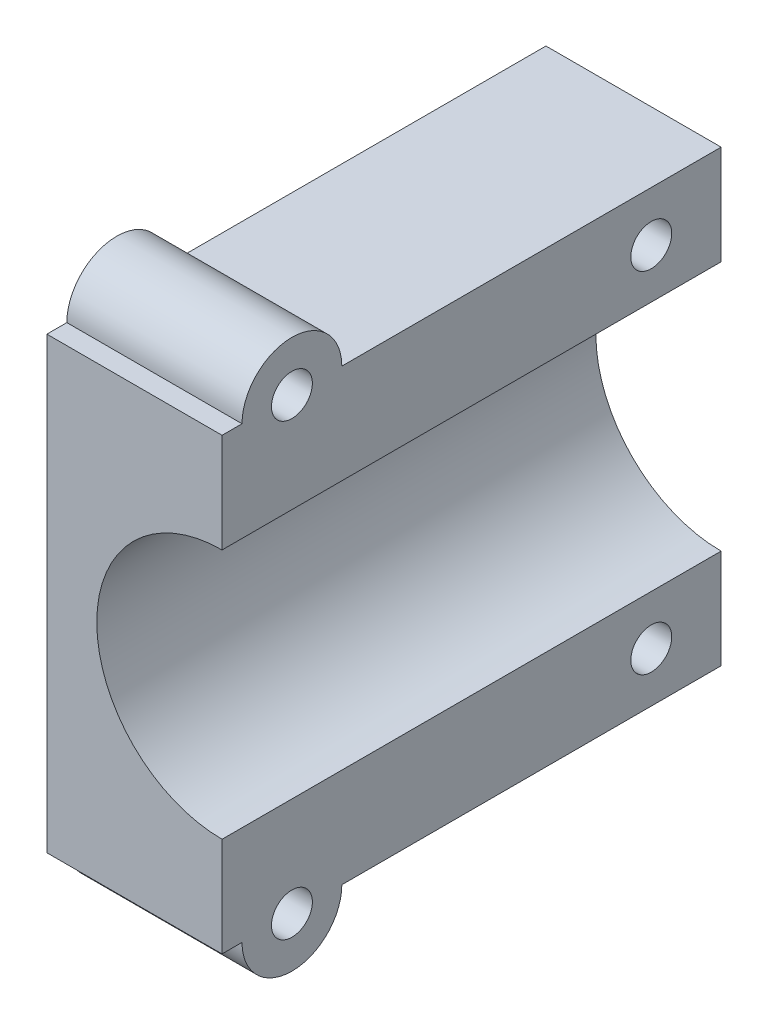
ISO-10303-21;
HEADER;
FILE_DESCRIPTION(('STEP AP214'),'2;1');
FILE_NAME('part.step','',(''),(''),'','','');
FILE_SCHEMA(('AUTOMOTIVE_DESIGN { 1 0 10303 214 1 1 1 1 }'));
ENDSEC;
DATA;
#1=APPLICATION_CONTEXT('core data for automotive mechanical design processes');
#2=APPLICATION_PROTOCOL_DEFINITION('international standard','automotive_design',2000,#1);
#3=PRODUCT_CONTEXT('',#1,'mechanical');
#4=PRODUCT('Part','Part','',(#3));
#5=PRODUCT_RELATED_PRODUCT_CATEGORY('part','',(#4));
#6=PRODUCT_DEFINITION_FORMATION('','',#4);
#7=PRODUCT_DEFINITION_CONTEXT('part definition',#1,'design');
#8=PRODUCT_DEFINITION('design','',#6,#7);
#9=PRODUCT_DEFINITION_SHAPE('','',#8);
#10=(LENGTH_UNIT() NAMED_UNIT(*) SI_UNIT(.MILLI.,.METRE.));
#11=(NAMED_UNIT(*) PLANE_ANGLE_UNIT() SI_UNIT($,.RADIAN.));
#12=(NAMED_UNIT(*) SI_UNIT($,.STERADIAN.) SOLID_ANGLE_UNIT());
#13=UNCERTAINTY_MEASURE_WITH_UNIT(LENGTH_MEASURE(1.E-05),#10,'distance_accuracy_value','');
#14=(GEOMETRIC_REPRESENTATION_CONTEXT(3) GLOBAL_UNCERTAINTY_ASSIGNED_CONTEXT((#13)) GLOBAL_UNIT_ASSIGNED_CONTEXT((#10,
#11,#12)) REPRESENTATION_CONTEXT('',''));
#15=CARTESIAN_POINT('',(0.,0.,0.));
#16=DIRECTION('',(0.,0.,1.));
#17=DIRECTION('',(1.,0.,0.));
#18=AXIS2_PLACEMENT_3D('',#15,#16,#17);
#19=CARTESIAN_POINT('',(-17.55,45.,25.));
#20=DIRECTION('',(0.,1.,0.));
#21=DIRECTION('',(0.,0.,1.));
#22=AXIS2_PLACEMENT_3D('',#19,#20,#21);
#23=PLANE('',#22);
#24=DIRECTION('',(0.,0.,-1.));
#25=VECTOR('',#24,1.);
#26=CARTESIAN_POINT('',(-17.55,45.,25.));
#27=LINE('',#26,#25);
#28=CARTESIAN_POINT('',(-17.55,45.,13.));
#29=VERTEX_POINT('',#28);
#30=CARTESIAN_POINT('',(-17.55,45.,-25.));
#31=VERTEX_POINT('',#30);
#32=EDGE_CURVE('E126',#29,#31,#27,.T.);
#33=ORIENTED_EDGE('',*,*,#32,.F.);
#34=DIRECTION('',(-1.,0.,0.));
#35=VECTOR('',#34,1.);
#36=CARTESIAN_POINT('',(0.,45.,13.));
#37=LINE('',#36,#35);
#38=CARTESIAN_POINT('',(0.,45.,13.));
#39=VERTEX_POINT('',#38);
#40=EDGE_CURVE('E113',#39,#29,#37,.T.);
#41=ORIENTED_EDGE('',*,*,#40,.F.);
#42=DIRECTION('',(0.,0.,1.));
#43=VECTOR('',#42,1.);
#44=CARTESIAN_POINT('',(0.,45.,-25.));
#45=LINE('',#44,#43);
#46=CARTESIAN_POINT('',(0.,45.,-25.));
#47=VERTEX_POINT('',#46);
#48=EDGE_CURVE('E124',#47,#39,#45,.T.);
#49=ORIENTED_EDGE('',*,*,#48,.F.);
#50=DIRECTION('',(1.,0.,0.));
#51=VECTOR('',#50,1.);
#52=CARTESIAN_POINT('',(-17.55,45.,-25.));
#53=LINE('',#52,#51);
#54=EDGE_CURVE('E155',#31,#47,#53,.T.);
#55=ORIENTED_EDGE('',*,*,#54,.F.);
#56=EDGE_LOOP('',(#33,#41,#49,#55));
#57=FACE_BOUND('',#56,.T.);
#58=ADVANCED_FACE('F35',(#57),#23,.T.);
#59=CARTESIAN_POINT('',(0.,45.,23.));
#60=VERTEX_POINT('',#59);
#61=CARTESIAN_POINT('',(0.,45.,25.));
#62=VERTEX_POINT('',#61);
#63=EDGE_CURVE('E132',#60,#62,#45,.T.);
#64=ORIENTED_EDGE('',*,*,#63,.F.);
#65=DIRECTION('',(-1.,0.,0.));
#66=VECTOR('',#65,1.);
#67=CARTESIAN_POINT('',(0.,45.,23.));
#68=LINE('',#67,#66);
#69=CARTESIAN_POINT('',(-17.55,45.,23.));
#70=VERTEX_POINT('',#69);
#71=EDGE_CURVE('E51',#60,#70,#68,.T.);
#72=ORIENTED_EDGE('',*,*,#71,.T.);
#73=CARTESIAN_POINT('',(-17.55,45.,25.));
#74=VERTEX_POINT('',#73);
#75=EDGE_CURVE('E160',#74,#70,#27,.T.);
#76=ORIENTED_EDGE('',*,*,#75,.F.);
#77=DIRECTION('',(1.,0.,0.));
#78=VECTOR('',#77,1.);
#79=CARTESIAN_POINT('',(-17.55,45.,25.));
#80=LINE('',#79,#78);
#81=EDGE_CURVE('E156',#74,#62,#80,.T.);
#82=ORIENTED_EDGE('',*,*,#81,.T.);
#83=EDGE_LOOP('',(#64,#72,#76,#82));
#84=FACE_BOUND('',#83,.T.);
#85=ADVANCED_FACE('F231',(#84),#23,.T.);
#86=CARTESIAN_POINT('',(-17.55,0.,25.));
#87=DIRECTION('',(0.,1.,0.));
#88=DIRECTION('',(0.,0.,1.));
#89=AXIS2_PLACEMENT_3D('',#86,#87,#88);
#90=PLANE('',#89);
#91=DIRECTION('',(0.,0.,-1.));
#92=VECTOR('',#91,1.);
#93=CARTESIAN_POINT('',(0.,0.,-25.));
#94=LINE('',#93,#92);
#95=CARTESIAN_POINT('',(0.,0.,13.));
#96=VERTEX_POINT('',#95);
#97=CARTESIAN_POINT('',(0.,0.,-25.));
#98=VERTEX_POINT('',#97);
#99=EDGE_CURVE('E131',#96,#98,#94,.T.);
#100=ORIENTED_EDGE('',*,*,#99,.F.);
#101=DIRECTION('',(-1.,0.,0.));
#102=VECTOR('',#101,1.);
#103=CARTESIAN_POINT('',(0.,0.,13.));
#104=LINE('',#103,#102);
#105=CARTESIAN_POINT('',(-17.55,0.,13.));
#106=VERTEX_POINT('',#105);
#107=EDGE_CURVE('E191',#96,#106,#104,.T.);
#108=ORIENTED_EDGE('',*,*,#107,.T.);
#109=DIRECTION('',(0.,0.,-1.));
#110=VECTOR('',#109,1.);
#111=CARTESIAN_POINT('',(-17.55,0.,25.));
#112=LINE('',#111,#110);
#113=CARTESIAN_POINT('',(-17.55,0.,-25.));
#114=VERTEX_POINT('',#113);
#115=EDGE_CURVE('E44',#106,#114,#112,.T.);
#116=ORIENTED_EDGE('',*,*,#115,.T.);
#117=DIRECTION('',(1.,0.,0.));
#118=VECTOR('',#117,1.);
#119=CARTESIAN_POINT('',(-17.55,0.,-25.));
#120=LINE('',#119,#118);
#121=EDGE_CURVE('E178',#114,#98,#120,.T.);
#122=ORIENTED_EDGE('',*,*,#121,.T.);
#123=EDGE_LOOP('',(#100,#108,#116,#122));
#124=FACE_BOUND('',#123,.T.);
#125=ADVANCED_FACE('F236',(#124),#90,.F.);
#126=CARTESIAN_POINT('',(-17.55,22.5,25.));
#127=DIRECTION('',(1.,0.,0.));
#128=DIRECTION('',(0.,1.,0.));
#129=AXIS2_PLACEMENT_3D('',#126,#127,#128);
#130=PLANE('',#129);
#131=CARTESIAN_POINT('',(-17.55,45.,18.));
#132=DIRECTION('',(1.,0.,0.));
#133=DIRECTION('',(0.,1.,0.));
#134=AXIS2_PLACEMENT_3D('',#131,#132,#133);
#135=CIRCLE('',#134,2.05);
#136=CARTESIAN_POINT('',(-17.55,47.05,18.));
#137=VERTEX_POINT('',#136);
#138=EDGE_CURVE('E214',#137,#137,#135,.T.);
#139=ORIENTED_EDGE('',*,*,#138,.T.);
#140=EDGE_LOOP('',(#139));
#141=FACE_BOUND('',#140,.T.);
#142=CARTESIAN_POINT('',(-17.55,0.,18.));
#143=DIRECTION('',(-1.,0.,0.));
#144=DIRECTION('',(0.,-1.,0.));
#145=AXIS2_PLACEMENT_3D('',#142,#143,#144);
#146=CIRCLE('',#145,2.05);
#147=CARTESIAN_POINT('',(-17.55,-2.05,18.));
#148=VERTEX_POINT('',#147);
#149=EDGE_CURVE('E206',#148,#148,#146,.T.);
#150=ORIENTED_EDGE('',*,*,#149,.F.);
#151=EDGE_LOOP('',(#150));
#152=FACE_BOUND('',#151,.T.);
#153=CARTESIAN_POINT('',(-17.55,40.,-18.));
#154=DIRECTION('',(1.,0.,0.));
#155=DIRECTION('',(0.,0.,1.));
#156=AXIS2_PLACEMENT_3D('',#153,#154,#155);
#157=CIRCLE('',#156,2.05);
#158=CARTESIAN_POINT('',(-17.55,40.,-15.95));
#159=VERTEX_POINT('',#158);
#160=EDGE_CURVE('E152',#159,#159,#157,.T.);
#161=ORIENTED_EDGE('',*,*,#160,.T.);
#162=EDGE_LOOP('',(#161));
#163=FACE_BOUND('',#162,.T.);
#164=CARTESIAN_POINT('',(-17.55,5.,-18.));
#165=DIRECTION('',(-1.,0.,0.));
#166=DIRECTION('',(0.,0.,1.));
#167=AXIS2_PLACEMENT_3D('',#164,#165,#166);
#168=CIRCLE('',#167,2.05);
#169=CARTESIAN_POINT('',(-17.55,5.,-15.95));
#170=VERTEX_POINT('',#169);
#171=EDGE_CURVE('E163',#170,#170,#168,.T.);
#172=ORIENTED_EDGE('',*,*,#171,.F.);
#173=EDGE_LOOP('',(#172));
#174=FACE_BOUND('',#173,.T.);
#175=DIRECTION('',(0.,-1.,0.));
#176=VECTOR('',#175,1.);
#177=CARTESIAN_POINT('',(-17.55,22.5,-25.));
#178=LINE('',#177,#176);
#179=EDGE_CURVE('E166',#31,#114,#178,.T.);
#180=ORIENTED_EDGE('',*,*,#179,.T.);
#181=ORIENTED_EDGE('',*,*,#115,.F.);
#182=CARTESIAN_POINT('',(-17.55,0.,18.));
#183=DIRECTION('',(-1.,0.,0.));
#184=DIRECTION('',(0.,-1.,0.));
#185=AXIS2_PLACEMENT_3D('',#182,#183,#184);
#186=CIRCLE('',#185,5.);
#187=CARTESIAN_POINT('',(-17.55,0.,23.));
#188=VERTEX_POINT('',#187);
#189=EDGE_CURVE('E199',#106,#188,#186,.T.);
#190=ORIENTED_EDGE('',*,*,#189,.T.);
#191=CARTESIAN_POINT('',(-17.55,0.,25.));
#192=VERTEX_POINT('',#191);
#193=EDGE_CURVE('E11',#192,#188,#112,.T.);
#194=ORIENTED_EDGE('',*,*,#193,.F.);
#195=DIRECTION('',(0.,-1.,0.));
#196=VECTOR('',#195,1.);
#197=CARTESIAN_POINT('',(-17.55,22.5,25.));
#198=LINE('',#197,#196);
#199=EDGE_CURVE('E167',#74,#192,#198,.T.);
#200=ORIENTED_EDGE('',*,*,#199,.F.);
#201=ORIENTED_EDGE('',*,*,#75,.T.);
#202=CARTESIAN_POINT('',(-17.55,45.,18.));
#203=DIRECTION('',(1.,0.,0.));
#204=DIRECTION('',(0.,1.,0.));
#205=AXIS2_PLACEMENT_3D('',#202,#203,#204);
#206=CIRCLE('',#205,5.);
#207=EDGE_CURVE('E118',#29,#70,#206,.T.);
#208=ORIENTED_EDGE('',*,*,#207,.F.);
#209=ORIENTED_EDGE('',*,*,#32,.T.);
#210=EDGE_LOOP('',(#180,#181,#190,#194,#200,#201,#208,#209));
#211=FACE_BOUND('',#210,.T.);
#212=ADVANCED_FACE('F37',(#141,#152,#163,#174,#211),#130,.F.);
#213=ORIENTED_EDGE('',*,*,#193,.T.);
#214=DIRECTION('',(-1.,0.,0.));
#215=VECTOR('',#214,1.);
#216=CARTESIAN_POINT('',(0.,0.,23.));
#217=LINE('',#216,#215);
#218=CARTESIAN_POINT('',(0.,0.,23.));
#219=VERTEX_POINT('',#218);
#220=EDGE_CURVE('E193',#219,#188,#217,.T.);
#221=ORIENTED_EDGE('',*,*,#220,.F.);
#222=CARTESIAN_POINT('',(0.,0.,25.));
#223=VERTEX_POINT('',#222);
#224=EDGE_CURVE('E134',#223,#219,#94,.T.);
#225=ORIENTED_EDGE('',*,*,#224,.F.);
#226=DIRECTION('',(1.,0.,0.));
#227=VECTOR('',#226,1.);
#228=CARTESIAN_POINT('',(-17.55,0.,25.));
#229=LINE('',#228,#227);
#230=EDGE_CURVE('E169',#192,#223,#229,.T.);
#231=ORIENTED_EDGE('',*,*,#230,.F.);
#232=EDGE_LOOP('',(#213,#221,#225,#231));
#233=FACE_BOUND('',#232,.T.);
#234=ADVANCED_FACE('F253',(#233),#90,.F.);
#235=CARTESIAN_POINT('',(0.,22.5,25.));
#236=DIRECTION('',(0.,0.,-1.));
#237=DIRECTION('',(-1.,0.,0.));
#238=AXIS2_PLACEMENT_3D('',#235,#236,#237);
#239=CYLINDRICAL_SURFACE('',#238,12.55);
#240=CARTESIAN_POINT('',(0.,22.5,-25.));
#241=DIRECTION('',(0.,0.,-1.));
#242=DIRECTION('',(1.,0.,0.));
#243=AXIS2_PLACEMENT_3D('',#240,#241,#242);
#244=CIRCLE('',#243,12.55);
#245=CARTESIAN_POINT('',(0.,9.95000000000002,-25.));
#246=VERTEX_POINT('',#245);
#247=CARTESIAN_POINT('',(0.,35.05,-25.));
#248=VERTEX_POINT('',#247);
#249=EDGE_CURVE('E170',#246,#248,#244,.T.);
#250=ORIENTED_EDGE('',*,*,#249,.T.);
#251=DIRECTION('',(0.,0.,-1.));
#252=VECTOR('',#251,1.);
#253=CARTESIAN_POINT('',(0.,35.05,25.));
#254=LINE('',#253,#252);
#255=CARTESIAN_POINT('',(0.,35.05,25.));
#256=VERTEX_POINT('',#255);
#257=EDGE_CURVE('E149',#248,#256,#254,.F.);
#258=ORIENTED_EDGE('',*,*,#257,.T.);
#259=CARTESIAN_POINT('',(0.,22.5,25.));
#260=DIRECTION('',(0.,0.,-1.));
#261=DIRECTION('',(1.,0.,0.));
#262=AXIS2_PLACEMENT_3D('',#259,#260,#261);
#263=CIRCLE('',#262,12.55);
#264=CARTESIAN_POINT('',(0.,9.95000000000001,25.));
#265=VERTEX_POINT('',#264);
#266=EDGE_CURVE('E173',#265,#256,#263,.T.);
#267=ORIENTED_EDGE('',*,*,#266,.F.);
#268=DIRECTION('',(0.,0.,-1.));
#269=VECTOR('',#268,1.);
#270=CARTESIAN_POINT('',(0.,9.95000000000001,25.));
#271=LINE('',#270,#269);
#272=EDGE_CURVE('E145',#265,#246,#271,.T.);
#273=ORIENTED_EDGE('',*,*,#272,.T.);
#274=EDGE_LOOP('',(#250,#258,#267,#273));
#275=FACE_BOUND('',#274,.T.);
#276=ADVANCED_FACE('F184',(#275),#239,.F.);
#277=CARTESIAN_POINT('',(0.,22.5,25.));
#278=DIRECTION('',(0.,0.,1.));
#279=DIRECTION('',(1.,0.,0.));
#280=AXIS2_PLACEMENT_3D('',#277,#278,#279);
#281=PLANE('',#280);
#282=DIRECTION('',(0.,-1.,0.));
#283=VECTOR('',#282,1.);
#284=CARTESIAN_POINT('',(0.,22.5,25.));
#285=LINE('',#284,#283);
#286=EDGE_CURVE('E146',#62,#256,#285,.T.);
#287=ORIENTED_EDGE('',*,*,#286,.F.);
#288=ORIENTED_EDGE('',*,*,#81,.F.);
#289=ORIENTED_EDGE('',*,*,#199,.T.);
#290=ORIENTED_EDGE('',*,*,#230,.T.);
#291=EDGE_CURVE('E143',#265,#223,#285,.T.);
#292=ORIENTED_EDGE('',*,*,#291,.F.);
#293=ORIENTED_EDGE('',*,*,#266,.T.);
#294=EDGE_LOOP('',(#287,#288,#289,#290,#292,#293));
#295=FACE_BOUND('',#294,.T.);
#296=ADVANCED_FACE('F246',(#295),#281,.T.);
#297=CARTESIAN_POINT('',(0.,22.5,-25.));
#298=DIRECTION('',(0.,0.,1.));
#299=DIRECTION('',(1.,0.,0.));
#300=AXIS2_PLACEMENT_3D('',#297,#298,#299);
#301=PLANE('',#300);
#302=ORIENTED_EDGE('',*,*,#54,.T.);
#303=DIRECTION('',(0.,1.,0.));
#304=VECTOR('',#303,1.);
#305=CARTESIAN_POINT('',(0.,45.,-25.));
#306=LINE('',#305,#304);
#307=EDGE_CURVE('E130',#248,#47,#306,.T.);
#308=ORIENTED_EDGE('',*,*,#307,.F.);
#309=ORIENTED_EDGE('',*,*,#249,.F.);
#310=EDGE_CURVE('E136',#98,#246,#306,.T.);
#311=ORIENTED_EDGE('',*,*,#310,.F.);
#312=ORIENTED_EDGE('',*,*,#121,.F.);
#313=ORIENTED_EDGE('',*,*,#179,.F.);
#314=EDGE_LOOP('',(#302,#308,#309,#311,#312,#313));
#315=FACE_BOUND('',#314,.T.);
#316=ADVANCED_FACE('F188',(#315),#301,.F.);
#317=CARTESIAN_POINT('',(23.3482756057297,5.,-18.));
#318=DIRECTION('',(-1.,0.,0.));
#319=DIRECTION('',(0.,0.,1.));
#320=AXIS2_PLACEMENT_3D('',#317,#318,#319);
#321=CYLINDRICAL_SURFACE('',#320,2.05);
#322=CARTESIAN_POINT('',(0.,5.,-18.));
#323=DIRECTION('',(-1.,0.,0.));
#324=DIRECTION('',(0.,0.,1.));
#325=AXIS2_PLACEMENT_3D('',#322,#323,#324);
#326=CIRCLE('',#325,2.05);
#327=CARTESIAN_POINT('',(0.,5.,-15.95));
#328=VERTEX_POINT('',#327);
#329=EDGE_CURVE('E140',#328,#328,#326,.F.);
#330=ORIENTED_EDGE('',*,*,#329,.T.);
#331=EDGE_LOOP('',(#330));
#332=FACE_BOUND('',#331,.T.);
#333=ORIENTED_EDGE('',*,*,#171,.T.);
#334=EDGE_LOOP('',(#333));
#335=FACE_BOUND('',#334,.T.);
#336=ADVANCED_FACE('F242',(#332,#335),#321,.F.);
#337=CARTESIAN_POINT('',(23.3482756057297,40.,-18.));
#338=DIRECTION('',(-1.,0.,0.));
#339=DIRECTION('',(0.,0.,1.));
#340=AXIS2_PLACEMENT_3D('',#337,#338,#339);
#341=CYLINDRICAL_SURFACE('',#340,2.05);
#342=CARTESIAN_POINT('',(0.,40.,-18.));
#343=DIRECTION('',(-1.,0.,0.));
#344=DIRECTION('',(0.,0.,1.));
#345=AXIS2_PLACEMENT_3D('',#342,#343,#344);
#346=CIRCLE('',#345,2.05);
#347=CARTESIAN_POINT('',(0.,40.,-15.95));
#348=VERTEX_POINT('',#347);
#349=EDGE_CURVE('E39',#348,#348,#346,.T.);
#350=CARTESIAN_POINT('',(0.,40.,-15.95));
#351=CARTESIAN_POINT('',(-0.182812499999996,40.,-15.95));
#352=CARTESIAN_POINT('',(-0.365624999999996,40.,-15.95));
#353=CARTESIAN_POINT('',(-0.731249999999996,40.,-15.95));
#354=CARTESIAN_POINT('',(-0.914062499999996,40.,-15.95));
#355=CARTESIAN_POINT('',(-1.2796875,40.,-15.95));
#356=CARTESIAN_POINT('',(-1.4625,40.,-15.95));
#357=CARTESIAN_POINT('',(-1.828125,40.,-15.95));
#358=CARTESIAN_POINT('',(-2.0109375,40.,-15.95));
#359=CARTESIAN_POINT('',(-2.3765625,40.,-15.95));
#360=CARTESIAN_POINT('',(-2.559375,40.,-15.95));
#361=CARTESIAN_POINT('',(-2.925,40.,-15.95));
#362=CARTESIAN_POINT('',(-3.1078125,40.,-15.95));
#363=CARTESIAN_POINT('',(-3.4734375,40.,-15.95));
#364=CARTESIAN_POINT('',(-3.65625,40.,-15.95));
#365=CARTESIAN_POINT('',(-4.021875,40.,-15.95));
#366=CARTESIAN_POINT('',(-4.2046875,40.,-15.95));
#367=CARTESIAN_POINT('',(-4.5703125,40.,-15.95));
#368=CARTESIAN_POINT('',(-4.753125,40.,-15.95));
#369=CARTESIAN_POINT('',(-5.11875,40.,-15.95));
#370=CARTESIAN_POINT('',(-5.3015625,40.,-15.95));
#371=CARTESIAN_POINT('',(-5.6671875,40.,-15.95));
#372=CARTESIAN_POINT('',(-5.85,40.,-15.95));
#373=CARTESIAN_POINT('',(-6.215625,40.,-15.95));
#374=CARTESIAN_POINT('',(-6.3984375,40.,-15.95));
#375=CARTESIAN_POINT('',(-6.7640625,40.,-15.95));
#376=CARTESIAN_POINT('',(-6.946875,40.,-15.95));
#377=CARTESIAN_POINT('',(-7.3125,40.,-15.95));
#378=CARTESIAN_POINT('',(-7.4953125,40.,-15.95));
#379=CARTESIAN_POINT('',(-7.8609375,40.,-15.95));
#380=CARTESIAN_POINT('',(-8.04374999999999,40.,-15.95));
#381=CARTESIAN_POINT('',(-8.40937499999999,40.,-15.95));
#382=CARTESIAN_POINT('',(-8.59218749999999,40.,-15.95));
#383=CARTESIAN_POINT('',(-8.95781249999999,40.,-15.95));
#384=CARTESIAN_POINT('',(-9.14062499999999,40.,-15.95));
#385=CARTESIAN_POINT('',(-9.50625,40.,-15.95));
#386=CARTESIAN_POINT('',(-9.6890625,40.,-15.95));
#387=CARTESIAN_POINT('',(-10.0546875,40.,-15.95));
#388=CARTESIAN_POINT('',(-10.2375,40.,-15.95));
#389=CARTESIAN_POINT('',(-10.603125,40.,-15.95));
#390=CARTESIAN_POINT('',(-10.7859375,40.,-15.95));
#391=CARTESIAN_POINT('',(-11.1515625,40.,-15.95));
#392=CARTESIAN_POINT('',(-11.334375,40.,-15.95));
#393=CARTESIAN_POINT('',(-11.7,40.,-15.95));
#394=CARTESIAN_POINT('',(-11.8828125,40.,-15.95));
#395=CARTESIAN_POINT('',(-12.2484375,40.,-15.95));
#396=CARTESIAN_POINT('',(-12.43125,40.,-15.95));
#397=CARTESIAN_POINT('',(-12.796875,40.,-15.95));
#398=CARTESIAN_POINT('',(-12.9796875,40.,-15.95));
#399=CARTESIAN_POINT('',(-13.3453125,40.,-15.95));
#400=CARTESIAN_POINT('',(-13.528125,40.,-15.95));
#401=CARTESIAN_POINT('',(-13.89375,40.,-15.95));
#402=CARTESIAN_POINT('',(-14.0765625,40.,-15.95));
#403=CARTESIAN_POINT('',(-14.4421875,40.,-15.95));
#404=CARTESIAN_POINT('',(-14.625,40.,-15.95));
#405=CARTESIAN_POINT('',(-14.990625,40.,-15.95));
#406=CARTESIAN_POINT('',(-15.1734375,40.,-15.95));
#407=CARTESIAN_POINT('',(-15.5390625,40.,-15.95));
#408=CARTESIAN_POINT('',(-15.721875,40.,-15.95));
#409=CARTESIAN_POINT('',(-16.0875,40.,-15.95));
#410=CARTESIAN_POINT('',(-16.2703125,40.,-15.95));
#411=CARTESIAN_POINT('',(-16.6359375,40.,-15.95));
#412=CARTESIAN_POINT('',(-16.81875,40.,-15.95));
#413=CARTESIAN_POINT('',(-17.184375,40.,-15.95));
#414=CARTESIAN_POINT('',(-17.3671875,40.,-15.95));
#415=CARTESIAN_POINT('',(-17.55,40.,-15.95));
#416=B_SPLINE_CURVE_WITH_KNOTS('',3,(#350,#351,#352,#353,#354,#355,#356,#357,#358,#359,#360,
#361,#362,#363,#364,#365,#366,#367,#368,#369,#370,#371,#372,#373,#374,#375,#376,#377,#378,#379,
#380,#381,#382,#383,#384,#385,#386,#387,#388,#389,#390,#391,#392,#393,#394,#395,#396,#397,#398,
#399,#400,#401,#402,#403,#404,#405,#406,#407,#408,#409,#410,#411,#412,#413,#414,#415),
.UNSPECIFIED.,.F.,.F.,(4,2,2,2,2,2,2,2,2,2,2,2,2,2,2,2,2,2,2,2,2,2,2,2,2,2,2,2,2,2,2,2,4),(0.,
0.548437499999999,1.096875,1.6453125,2.19375,2.7421875,3.290625,3.8390625,4.3875,4.9359375,
5.484375,6.0328125,6.58125,7.1296875,7.678125,8.2265625,8.775,9.3234375,9.871875,10.4203125,
10.96875,11.5171875,12.065625,12.6140625,13.1625,13.7109375,14.259375,14.8078125,15.35625,
15.9046875,16.453125,17.0015625,17.55),.UNSPECIFIED.);
#417=EDGE_CURVE('BSEAM240',#348,#159,#416,.T.);
#418=ORIENTED_EDGE('',*,*,#349,.F.);
#419=ORIENTED_EDGE('',*,*,#160,.F.);
#420=ORIENTED_EDGE('',*,*,#417,.T.);
#421=ORIENTED_EDGE('',*,*,#417,.F.);
#422=EDGE_LOOP('',(#418,#420,#419,#421));
#423=FACE_BOUND('',#422,.T.);
#424=ADVANCED_FACE('F240',(#423),#341,.F.);
#425=CARTESIAN_POINT('',(0.,0.,0.));
#426=DIRECTION('',(-1.,0.,0.));
#427=DIRECTION('',(0.,0.,1.));
#428=AXIS2_PLACEMENT_3D('',#425,#426,#427);
#429=PLANE('',#428);
#430=CARTESIAN_POINT('',(0.,45.,18.));
#431=DIRECTION('',(-1.,0.,0.));
#432=DIRECTION('',(0.,0.,1.));
#433=AXIS2_PLACEMENT_3D('',#430,#431,#432);
#434=CIRCLE('',#433,2.05);
#435=CARTESIAN_POINT('',(0.,45.,20.05));
#436=VERTEX_POINT('',#435);
#437=EDGE_CURVE('E210',#436,#436,#434,.T.);
#438=ORIENTED_EDGE('',*,*,#437,.T.);
#439=EDGE_LOOP('',(#438));
#440=FACE_BOUND('',#439,.T.);
#441=ORIENTED_EDGE('',*,*,#349,.T.);
#442=EDGE_LOOP('',(#441));
#443=FACE_BOUND('',#442,.T.);
#444=ORIENTED_EDGE('',*,*,#307,.T.);
#445=ORIENTED_EDGE('',*,*,#48,.T.);
#446=CARTESIAN_POINT('',(0.,45.,18.));
#447=DIRECTION('',(1.,0.,0.));
#448=DIRECTION('',(0.,1.,0.));
#449=AXIS2_PLACEMENT_3D('',#446,#447,#448);
#450=CIRCLE('',#449,5.);
#451=EDGE_CURVE('E110',#39,#60,#450,.T.);
#452=ORIENTED_EDGE('',*,*,#451,.T.);
#453=ORIENTED_EDGE('',*,*,#63,.T.);
#454=ORIENTED_EDGE('',*,*,#286,.T.);
#455=ORIENTED_EDGE('',*,*,#257,.F.);
#456=EDGE_LOOP('',(#444,#445,#452,#453,#454,#455));
#457=FACE_BOUND('',#456,.T.);
#458=ADVANCED_FACE('F128',(#440,#443,#457),#429,.F.);
#459=CARTESIAN_POINT('',(0.,0.,18.));
#460=DIRECTION('',(-1.,0.,0.));
#461=DIRECTION('',(0.,0.,1.));
#462=AXIS2_PLACEMENT_3D('',#459,#460,#461);
#463=CIRCLE('',#462,2.05);
#464=CARTESIAN_POINT('',(0.,0.,20.05));
#465=VERTEX_POINT('',#464);
#466=EDGE_CURVE('E202',#465,#465,#463,.F.);
#467=ORIENTED_EDGE('',*,*,#466,.F.);
#468=EDGE_LOOP('',(#467));
#469=FACE_BOUND('',#468,.T.);
#470=ORIENTED_EDGE('',*,*,#329,.F.);
#471=EDGE_LOOP('',(#470));
#472=FACE_BOUND('',#471,.T.);
#473=ORIENTED_EDGE('',*,*,#291,.T.);
#474=ORIENTED_EDGE('',*,*,#224,.T.);
#475=CARTESIAN_POINT('',(0.,0.,18.));
#476=DIRECTION('',(-1.,0.,0.));
#477=DIRECTION('',(0.,-1.,0.));
#478=AXIS2_PLACEMENT_3D('',#475,#476,#477);
#479=CIRCLE('',#478,5.);
#480=EDGE_CURVE('E59',#96,#219,#479,.T.);
#481=ORIENTED_EDGE('',*,*,#480,.F.);
#482=ORIENTED_EDGE('',*,*,#99,.T.);
#483=ORIENTED_EDGE('',*,*,#310,.T.);
#484=ORIENTED_EDGE('',*,*,#272,.F.);
#485=EDGE_LOOP('',(#473,#474,#481,#482,#483,#484));
#486=FACE_BOUND('',#485,.T.);
#487=ADVANCED_FACE('F262',(#469,#472,#486),#429,.F.);
#488=CARTESIAN_POINT('',(0.,0.,18.));
#489=DIRECTION('',(-1.,0.,0.));
#490=DIRECTION('',(0.,-1.,0.));
#491=AXIS2_PLACEMENT_3D('',#488,#489,#490);
#492=CYLINDRICAL_SURFACE('',#491,5.);
#493=ORIENTED_EDGE('',*,*,#189,.F.);
#494=ORIENTED_EDGE('',*,*,#107,.F.);
#495=ORIENTED_EDGE('',*,*,#480,.T.);
#496=ORIENTED_EDGE('',*,*,#220,.T.);
#497=EDGE_LOOP('',(#493,#494,#495,#496));
#498=FACE_BOUND('',#497,.T.);
#499=ADVANCED_FACE('F283',(#498),#492,.T.);
#500=CARTESIAN_POINT('',(5.79827560572969,0.,18.));
#501=DIRECTION('',(-1.,0.,0.));
#502=DIRECTION('',(0.,-1.,0.));
#503=AXIS2_PLACEMENT_3D('',#500,#501,#502);
#504=CYLINDRICAL_SURFACE('',#503,2.05);
#505=ORIENTED_EDGE('',*,*,#466,.T.);
#506=EDGE_LOOP('',(#505));
#507=FACE_BOUND('',#506,.T.);
#508=ORIENTED_EDGE('',*,*,#149,.T.);
#509=EDGE_LOOP('',(#508));
#510=FACE_BOUND('',#509,.T.);
#511=ADVANCED_FACE('F227',(#507,#510),#504,.F.);
#512=CARTESIAN_POINT('',(0.,45.,18.));
#513=DIRECTION('',(-1.,0.,0.));
#514=DIRECTION('',(0.,-1.,0.));
#515=AXIS2_PLACEMENT_3D('',#512,#513,#514);
#516=CYLINDRICAL_SURFACE('',#515,5.);
#517=ORIENTED_EDGE('',*,*,#207,.T.);
#518=ORIENTED_EDGE('',*,*,#71,.F.);
#519=ORIENTED_EDGE('',*,*,#451,.F.);
#520=ORIENTED_EDGE('',*,*,#40,.T.);
#521=EDGE_LOOP('',(#517,#518,#519,#520));
#522=FACE_BOUND('',#521,.T.);
#523=ADVANCED_FACE('F112',(#522),#516,.T.);
#524=CARTESIAN_POINT('',(5.79827560572969,45.,18.));
#525=DIRECTION('',(-1.,0.,0.));
#526=DIRECTION('',(0.,-1.,0.));
#527=AXIS2_PLACEMENT_3D('',#524,#525,#526);
#528=CYLINDRICAL_SURFACE('',#527,2.05);
#529=ORIENTED_EDGE('',*,*,#437,.F.);
#530=EDGE_LOOP('',(#529));
#531=FACE_BOUND('',#530,.T.);
#532=ORIENTED_EDGE('',*,*,#138,.F.);
#533=EDGE_LOOP('',(#532));
#534=FACE_BOUND('',#533,.T.);
#535=ADVANCED_FACE('F220',(#531,#534),#528,.F.);
#536=CLOSED_SHELL('',(#58,#85,#125,#212,#234,#276,#296,#316,#336,#424,#458,#487,#499,#511,#523,#535));
#537=MANIFOLD_SOLID_BREP('B2',#536);
#538=ADVANCED_BREP_SHAPE_REPRESENTATION('',(#18,#537),#14);
#539=SHAPE_DEFINITION_REPRESENTATION(#9,#538);
ENDSEC;
END-ISO-10303-21;
